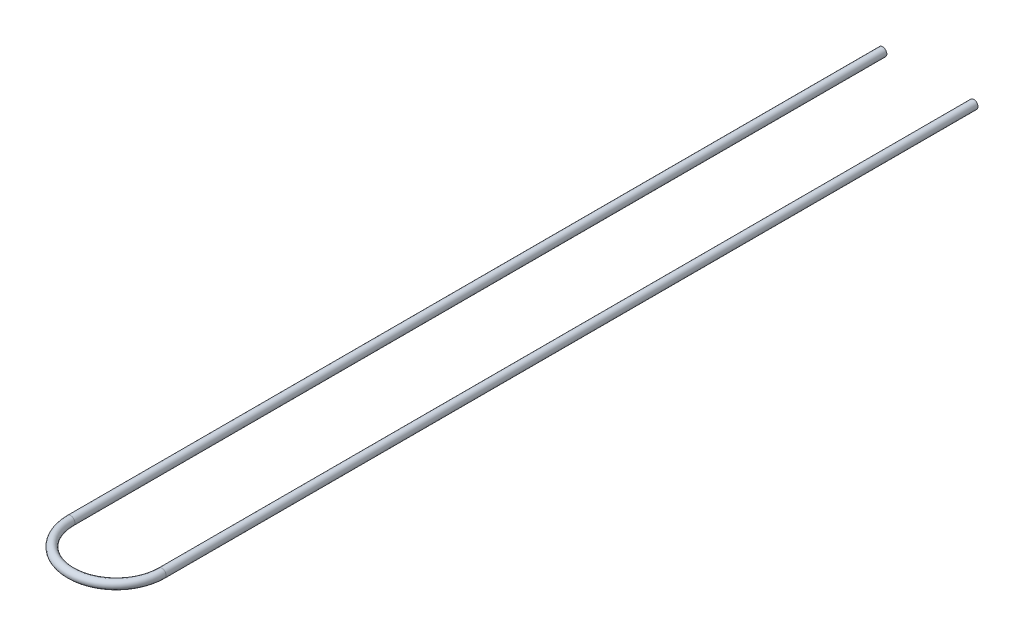
ISO-10303-21;
HEADER;
FILE_DESCRIPTION(('STEP AP214'),'2;1');
FILE_NAME('part.step','',(''),(''),'','','');
FILE_SCHEMA(('AUTOMOTIVE_DESIGN { 1 0 10303 214 1 1 1 1 }'));
ENDSEC;
DATA;
#1=APPLICATION_CONTEXT('core data for automotive mechanical design processes');
#2=APPLICATION_PROTOCOL_DEFINITION('international standard','automotive_design',2000,#1);
#3=PRODUCT_CONTEXT('',#1,'mechanical');
#4=PRODUCT('Part','Part','',(#3));
#5=PRODUCT_RELATED_PRODUCT_CATEGORY('part','',(#4));
#6=PRODUCT_DEFINITION_FORMATION('','',#4);
#7=PRODUCT_DEFINITION_CONTEXT('part definition',#1,'design');
#8=PRODUCT_DEFINITION('design','',#6,#7);
#9=PRODUCT_DEFINITION_SHAPE('','',#8);
#10=(LENGTH_UNIT() NAMED_UNIT(*) SI_UNIT(.MILLI.,.METRE.));
#11=(NAMED_UNIT(*) PLANE_ANGLE_UNIT() SI_UNIT($,.RADIAN.));
#12=(NAMED_UNIT(*) SI_UNIT($,.STERADIAN.) SOLID_ANGLE_UNIT());
#13=UNCERTAINTY_MEASURE_WITH_UNIT(LENGTH_MEASURE(1.E-05),#10,'distance_accuracy_value','');
#14=(GEOMETRIC_REPRESENTATION_CONTEXT(3) GLOBAL_UNCERTAINTY_ASSIGNED_CONTEXT((#13)) GLOBAL_UNIT_ASSIGNED_CONTEXT((#10,
#11,#12)) REPRESENTATION_CONTEXT('',''));
#15=CARTESIAN_POINT('',(0.,0.,0.));
#16=DIRECTION('',(0.,0.,1.));
#17=DIRECTION('',(1.,0.,0.));
#18=AXIS2_PLACEMENT_3D('',#15,#16,#17);
#19=CARTESIAN_POINT('',(-40.,0.,299.999999999999));
#20=DIRECTION('',(0.,0.,1.));
#21=DIRECTION('',(1.,0.,0.));
#22=AXIS2_PLACEMENT_3D('',#19,#20,#21);
#23=CYLINDRICAL_SURFACE('',#22,11.1);
#24=CARTESIAN_POINT('',(-39.9999999999997,0.,2440.));
#25=DIRECTION('',(0.,0.,1.));
#26=DIRECTION('',(1.,0.,0.));
#27=AXIS2_PLACEMENT_3D('',#24,#25,#26);
#28=CIRCLE('',#27,11.1);
#29=CARTESIAN_POINT('',(-51.0999999999997,0.,2440.));
#30=VERTEX_POINT('',#29);
#31=EDGE_CURVE('E54',#30,#30,#28,.T.);
#32=ORIENTED_EDGE('',*,*,#31,.F.);
#33=EDGE_LOOP('',(#32));
#34=FACE_BOUND('',#33,.T.);
#35=CARTESIAN_POINT('',(-40.,0.,299.999999999999));
#36=DIRECTION('',(0.,0.,1.));
#37=DIRECTION('',(1.,0.,0.));
#38=AXIS2_PLACEMENT_3D('',#35,#36,#37);
#39=CIRCLE('',#38,11.1);
#40=CARTESIAN_POINT('',(-28.9,0.,299.999999999999));
#41=VERTEX_POINT('',#40);
#42=EDGE_CURVE('E52',#41,#41,#39,.T.);
#43=ORIENTED_EDGE('',*,*,#42,.T.);
#44=EDGE_LOOP('',(#43));
#45=FACE_BOUND('',#44,.T.);
#46=ADVANCED_FACE('F31',(#34,#45),#23,.T.);
#47=CARTESIAN_POINT('',(80.1550000000003,0.,2440.));
#48=DIRECTION('',(0.,1.,0.));
#49=DIRECTION('',(0.,0.,1.));
#50=AXIS2_PLACEMENT_3D('',#47,#48,#49);
#51=TOROIDAL_SURFACE('',#50,120.155,11.1);
#52=CARTESIAN_POINT('',(200.31,0.,2440.));
#53=DIRECTION('',(0.,0.,-1.));
#54=DIRECTION('',(-1.,0.,0.));
#55=AXIS2_PLACEMENT_3D('',#52,#53,#54);
#56=CIRCLE('',#55,11.1);
#57=CARTESIAN_POINT('',(211.41,0.,2440.));
#58=VERTEX_POINT('',#57);
#59=EDGE_CURVE('E35',#58,#58,#56,.T.);
#60=CARTESIAN_POINT('',(80.1550000000003,0.,2440.));
#61=DIRECTION('',(0.,1.,0.));
#62=DIRECTION('',(0.,0.,1.));
#63=AXIS2_PLACEMENT_3D('',#60,#61,#62);
#64=CIRCLE('',#63,131.255);
#65=EDGE_CURVE('',#30,#58,#64,.T.);
#66=ORIENTED_EDGE('',*,*,#31,.T.);
#67=ORIENTED_EDGE('',*,*,#59,.F.);
#68=ORIENTED_EDGE('',*,*,#65,.T.);
#69=ORIENTED_EDGE('',*,*,#65,.F.);
#70=EDGE_LOOP('',(#66,#68,#67,#69));
#71=FACE_BOUND('',#70,.T.);
#72=ADVANCED_FACE('F62',(#71),#51,.T.);
#73=CARTESIAN_POINT('',(200.31,0.,2440.));
#74=DIRECTION('',(0.,0.,-1.));
#75=DIRECTION('',(-1.,0.,0.));
#76=AXIS2_PLACEMENT_3D('',#73,#74,#75);
#77=CYLINDRICAL_SURFACE('',#76,11.1);
#78=CARTESIAN_POINT('',(200.31,0.,299.999999999999));
#79=DIRECTION('',(0.,0.,-1.));
#80=DIRECTION('',(-1.,0.,0.));
#81=AXIS2_PLACEMENT_3D('',#78,#79,#80);
#82=CIRCLE('',#81,11.1);
#83=CARTESIAN_POINT('',(189.21,0.,299.999999999999));
#84=VERTEX_POINT('',#83);
#85=EDGE_CURVE('E48',#84,#84,#82,.T.);
#86=ORIENTED_EDGE('',*,*,#85,.F.);
#87=EDGE_LOOP('',(#86));
#88=FACE_BOUND('',#87,.T.);
#89=ORIENTED_EDGE('',*,*,#59,.T.);
#90=EDGE_LOOP('',(#89));
#91=FACE_BOUND('',#90,.T.);
#92=ADVANCED_FACE('F33',(#88,#91),#77,.T.);
#93=CARTESIAN_POINT('',(-40.,0.,299.999999999999));
#94=DIRECTION('',(0.,0.,1.));
#95=DIRECTION('',(1.,0.,0.));
#96=AXIS2_PLACEMENT_3D('',#93,#94,#95);
#97=PLANE('',#96);
#98=CARTESIAN_POINT('',(-40.,0.,299.999999999999));
#99=DIRECTION('',(0.,0.,1.));
#100=DIRECTION('',(1.,0.,0.));
#101=AXIS2_PLACEMENT_3D('',#98,#99,#100);
#102=CIRCLE('',#101,9.94999999999998);
#103=CARTESIAN_POINT('',(-30.05,0.,299.999999999999));
#104=VERTEX_POINT('',#103);
#105=EDGE_CURVE('E51',#104,#104,#102,.F.);
#106=ORIENTED_EDGE('',*,*,#105,.F.);
#107=EDGE_LOOP('',(#106));
#108=FACE_BOUND('',#107,.T.);
#109=ORIENTED_EDGE('',*,*,#42,.F.);
#110=EDGE_LOOP('',(#109));
#111=FACE_BOUND('',#110,.T.);
#112=ADVANCED_FACE('F68',(#108,#111),#97,.F.);
#113=CARTESIAN_POINT('',(200.31,0.,299.999999999999));
#114=DIRECTION('',(0.,0.,-1.));
#115=DIRECTION('',(-1.,0.,0.));
#116=AXIS2_PLACEMENT_3D('',#113,#114,#115);
#117=PLANE('',#116);
#118=CARTESIAN_POINT('',(200.31,0.,299.999999999999));
#119=DIRECTION('',(0.,0.,-1.));
#120=DIRECTION('',(-1.,0.,0.));
#121=AXIS2_PLACEMENT_3D('',#118,#119,#120);
#122=CIRCLE('',#121,9.94999999999998);
#123=CARTESIAN_POINT('',(190.36,0.,299.999999999999));
#124=VERTEX_POINT('',#123);
#125=EDGE_CURVE('E10',#124,#124,#122,.F.);
#126=ORIENTED_EDGE('',*,*,#125,.T.);
#127=EDGE_LOOP('',(#126));
#128=FACE_BOUND('',#127,.T.);
#129=ORIENTED_EDGE('',*,*,#85,.T.);
#130=EDGE_LOOP('',(#129));
#131=FACE_BOUND('',#130,.T.);
#132=ADVANCED_FACE('F86',(#128,#131),#117,.T.);
#133=CARTESIAN_POINT('',(-40.,0.,299.999999999999));
#134=DIRECTION('',(0.,0.,1.));
#135=DIRECTION('',(1.,0.,0.));
#136=AXIS2_PLACEMENT_3D('',#133,#134,#135);
#137=CYLINDRICAL_SURFACE('',#136,9.94999999999998);
#138=CARTESIAN_POINT('',(-39.9999999999997,0.,2440.));
#139=DIRECTION('',(0.,0.,1.));
#140=DIRECTION('',(1.,0.,0.));
#141=AXIS2_PLACEMENT_3D('',#138,#139,#140);
#142=CIRCLE('',#141,9.94999999999998);
#143=CARTESIAN_POINT('',(-49.9499999999997,0.,2440.));
#144=VERTEX_POINT('',#143);
#145=EDGE_CURVE('E44',#144,#144,#142,.F.);
#146=ORIENTED_EDGE('',*,*,#145,.F.);
#147=EDGE_LOOP('',(#146));
#148=FACE_BOUND('',#147,.T.);
#149=ORIENTED_EDGE('',*,*,#105,.T.);
#150=EDGE_LOOP('',(#149));
#151=FACE_BOUND('',#150,.T.);
#152=ADVANCED_FACE('F80',(#148,#151),#137,.F.);
#153=CARTESIAN_POINT('',(80.1550000000003,0.,2440.));
#154=DIRECTION('',(0.,1.,0.));
#155=DIRECTION('',(0.,0.,1.));
#156=AXIS2_PLACEMENT_3D('',#153,#154,#155);
#157=TOROIDAL_SURFACE('',#156,120.155,9.94999999999998);
#158=CARTESIAN_POINT('',(200.31,0.,2440.));
#159=DIRECTION('',(0.,0.,-1.));
#160=DIRECTION('',(-1.,0.,0.));
#161=AXIS2_PLACEMENT_3D('',#158,#159,#160);
#162=CIRCLE('',#161,9.94999999999998);
#163=CARTESIAN_POINT('',(210.26,0.,2440.));
#164=VERTEX_POINT('',#163);
#165=EDGE_CURVE('E39',#164,#164,#162,.F.);
#166=CARTESIAN_POINT('',(80.1550000000003,0.,2440.));
#167=DIRECTION('',(0.,1.,0.));
#168=DIRECTION('',(0.,0.,1.));
#169=AXIS2_PLACEMENT_3D('',#166,#167,#168);
#170=CIRCLE('',#169,130.105);
#171=EDGE_CURVE('',#144,#164,#170,.T.);
#172=ORIENTED_EDGE('',*,*,#145,.T.);
#173=ORIENTED_EDGE('',*,*,#165,.F.);
#174=ORIENTED_EDGE('',*,*,#171,.T.);
#175=ORIENTED_EDGE('',*,*,#171,.F.);
#176=EDGE_LOOP('',(#172,#174,#173,#175));
#177=FACE_BOUND('',#176,.T.);
#178=ADVANCED_FACE('F74',(#177),#157,.F.);
#179=CARTESIAN_POINT('',(200.31,0.,2440.));
#180=DIRECTION('',(0.,0.,-1.));
#181=DIRECTION('',(-1.,0.,0.));
#182=AXIS2_PLACEMENT_3D('',#179,#180,#181);
#183=CYLINDRICAL_SURFACE('',#182,9.94999999999998);
#184=ORIENTED_EDGE('',*,*,#125,.F.);
#185=EDGE_LOOP('',(#184));
#186=FACE_BOUND('',#185,.T.);
#187=ORIENTED_EDGE('',*,*,#165,.T.);
#188=EDGE_LOOP('',(#187));
#189=FACE_BOUND('',#188,.T.);
#190=ADVANCED_FACE('F72',(#186,#189),#183,.F.);
#191=CLOSED_SHELL('',(#46,#72,#92,#112,#132,#152,#178,#190));
#192=MANIFOLD_SOLID_BREP('B2',#191);
#193=ADVANCED_BREP_SHAPE_REPRESENTATION('',(#18,#192),#14);
#194=SHAPE_DEFINITION_REPRESENTATION(#9,#193);
ENDSEC;
END-ISO-10303-21;
